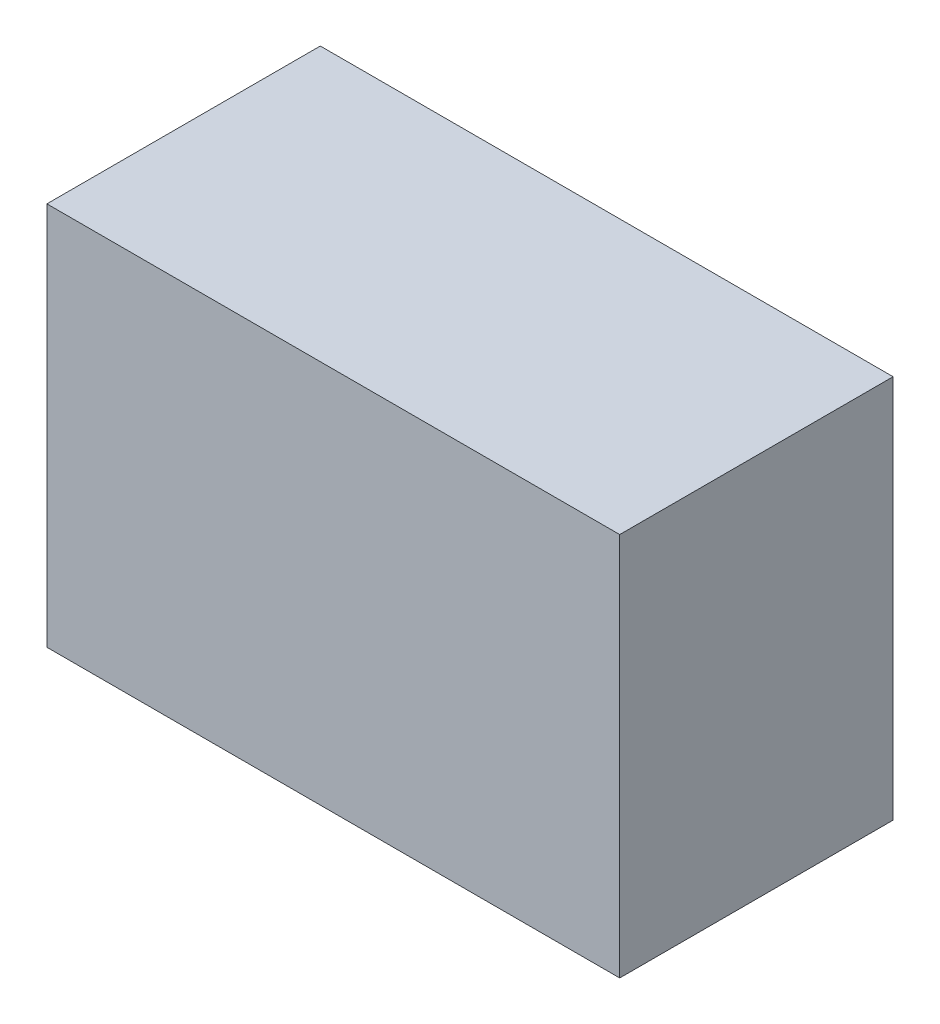
ISO-10303-21;
HEADER;
FILE_DESCRIPTION(('STEP AP214'),'2;1');
FILE_NAME('part.step','',(''),(''),'','','');
FILE_SCHEMA(('AUTOMOTIVE_DESIGN { 1 0 10303 214 1 1 1 1 }'));
ENDSEC;
DATA;
#1=APPLICATION_CONTEXT('core data for automotive mechanical design processes');
#2=APPLICATION_PROTOCOL_DEFINITION('international standard','automotive_design',2000,#1);
#3=PRODUCT_CONTEXT('',#1,'mechanical');
#4=PRODUCT('Part','Part','',(#3));
#5=PRODUCT_RELATED_PRODUCT_CATEGORY('part','',(#4));
#6=PRODUCT_DEFINITION_FORMATION('','',#4);
#7=PRODUCT_DEFINITION_CONTEXT('part definition',#1,'design');
#8=PRODUCT_DEFINITION('design','',#6,#7);
#9=PRODUCT_DEFINITION_SHAPE('','',#8);
#10=(LENGTH_UNIT() NAMED_UNIT(*) SI_UNIT(.MILLI.,.METRE.));
#11=(NAMED_UNIT(*) PLANE_ANGLE_UNIT() SI_UNIT($,.RADIAN.));
#12=(NAMED_UNIT(*) SI_UNIT($,.STERADIAN.) SOLID_ANGLE_UNIT());
#13=UNCERTAINTY_MEASURE_WITH_UNIT(LENGTH_MEASURE(1.E-05),#10,'distance_accuracy_value','');
#14=(GEOMETRIC_REPRESENTATION_CONTEXT(3) GLOBAL_UNCERTAINTY_ASSIGNED_CONTEXT((#13)) GLOBAL_UNIT_ASSIGNED_CONTEXT((#10,
#11,#12)) REPRESENTATION_CONTEXT('',''));
#15=CARTESIAN_POINT('',(0.,0.,0.));
#16=DIRECTION('',(0.,0.,1.));
#17=DIRECTION('',(1.,0.,0.));
#18=AXIS2_PLACEMENT_3D('',#15,#16,#17);
#19=CARTESIAN_POINT('',(-220.,295.,-95.));
#20=DIRECTION('',(1.,0.,0.));
#21=DIRECTION('',(0.,0.,-1.));
#22=AXIS2_PLACEMENT_3D('',#19,#20,#21);
#23=PLANE('',#22);
#24=DIRECTION('',(0.,0.,1.));
#25=VECTOR('',#24,1.);
#26=CARTESIAN_POINT('',(-220.,0.,-95.));
#27=LINE('',#26,#25);
#28=CARTESIAN_POINT('',(-220.,0.,-95.));
#29=VERTEX_POINT('',#28);
#30=CARTESIAN_POINT('',(-220.,0.,115.));
#31=VERTEX_POINT('',#30);
#32=EDGE_CURVE('E96',#29,#31,#27,.T.);
#33=ORIENTED_EDGE('',*,*,#32,.T.);
#34=DIRECTION('',(0.,-1.,0.));
#35=VECTOR('',#34,1.);
#36=CARTESIAN_POINT('',(-220.,295.,115.));
#37=LINE('',#36,#35);
#38=CARTESIAN_POINT('',(-220.,295.,115.));
#39=VERTEX_POINT('',#38);
#40=EDGE_CURVE('E11',#39,#31,#37,.T.);
#41=ORIENTED_EDGE('',*,*,#40,.F.);
#42=DIRECTION('',(0.,0.,1.));
#43=VECTOR('',#42,1.);
#44=CARTESIAN_POINT('',(-220.,295.,-95.));
#45=LINE('',#44,#43);
#46=CARTESIAN_POINT('',(-220.,295.,-95.));
#47=VERTEX_POINT('',#46);
#48=EDGE_CURVE('E84',#47,#39,#45,.T.);
#49=ORIENTED_EDGE('',*,*,#48,.F.);
#50=DIRECTION('',(0.,-1.,0.));
#51=VECTOR('',#50,1.);
#52=CARTESIAN_POINT('',(-220.,295.,-95.));
#53=LINE('',#52,#51);
#54=EDGE_CURVE('E92',#47,#29,#53,.T.);
#55=ORIENTED_EDGE('',*,*,#54,.T.);
#56=EDGE_LOOP('',(#33,#41,#49,#55));
#57=FACE_BOUND('',#56,.T.);
#58=ADVANCED_FACE('F33',(#57),#23,.F.);
#59=CARTESIAN_POINT('',(-220.,295.,115.));
#60=DIRECTION('',(0.,0.,-1.));
#61=DIRECTION('',(-1.,0.,0.));
#62=AXIS2_PLACEMENT_3D('',#59,#60,#61);
#63=PLANE('',#62);
#64=DIRECTION('',(1.,0.,0.));
#65=VECTOR('',#64,1.);
#66=CARTESIAN_POINT('',(-220.,0.,115.));
#67=LINE('',#66,#65);
#68=CARTESIAN_POINT('',(220.,0.,115.));
#69=VERTEX_POINT('',#68);
#70=EDGE_CURVE('E88',#31,#69,#67,.T.);
#71=ORIENTED_EDGE('',*,*,#70,.T.);
#72=DIRECTION('',(0.,-1.,0.));
#73=VECTOR('',#72,1.);
#74=CARTESIAN_POINT('',(220.,295.,115.));
#75=LINE('',#74,#73);
#76=CARTESIAN_POINT('',(220.,295.,115.));
#77=VERTEX_POINT('',#76);
#78=EDGE_CURVE('E41',#77,#69,#75,.T.);
#79=ORIENTED_EDGE('',*,*,#78,.F.);
#80=DIRECTION('',(1.,0.,0.));
#81=VECTOR('',#80,1.);
#82=CARTESIAN_POINT('',(-220.,295.,115.));
#83=LINE('',#82,#81);
#84=EDGE_CURVE('E79',#39,#77,#83,.T.);
#85=ORIENTED_EDGE('',*,*,#84,.F.);
#86=ORIENTED_EDGE('',*,*,#40,.T.);
#87=EDGE_LOOP('',(#71,#79,#85,#86));
#88=FACE_BOUND('',#87,.T.);
#89=ADVANCED_FACE('F87',(#88),#63,.F.);
#90=CARTESIAN_POINT('',(220.,295.,-95.));
#91=DIRECTION('',(-1.,0.,0.));
#92=DIRECTION('',(0.,0.,1.));
#93=AXIS2_PLACEMENT_3D('',#90,#91,#92);
#94=PLANE('',#93);
#95=DIRECTION('',(0.,0.,-1.));
#96=VECTOR('',#95,1.);
#97=CARTESIAN_POINT('',(220.,0.,-95.));
#98=LINE('',#97,#96);
#99=CARTESIAN_POINT('',(220.,0.,-95.));
#100=VERTEX_POINT('',#99);
#101=EDGE_CURVE('E66',#69,#100,#98,.T.);
#102=ORIENTED_EDGE('',*,*,#101,.T.);
#103=DIRECTION('',(0.,-1.,0.));
#104=VECTOR('',#103,1.);
#105=CARTESIAN_POINT('',(220.,295.,-95.));
#106=LINE('',#105,#104);
#107=CARTESIAN_POINT('',(220.,295.,-95.));
#108=VERTEX_POINT('',#107);
#109=EDGE_CURVE('E89',#108,#100,#106,.T.);
#110=ORIENTED_EDGE('',*,*,#109,.F.);
#111=DIRECTION('',(0.,0.,-1.));
#112=VECTOR('',#111,1.);
#113=CARTESIAN_POINT('',(220.,295.,-95.));
#114=LINE('',#113,#112);
#115=EDGE_CURVE('E82',#77,#108,#114,.T.);
#116=ORIENTED_EDGE('',*,*,#115,.F.);
#117=ORIENTED_EDGE('',*,*,#78,.T.);
#118=EDGE_LOOP('',(#102,#110,#116,#117));
#119=FACE_BOUND('',#118,.T.);
#120=ADVANCED_FACE('F90',(#119),#94,.F.);
#121=CARTESIAN_POINT('',(-220.,295.,-95.));
#122=DIRECTION('',(0.,0.,1.));
#123=DIRECTION('',(1.,0.,0.));
#124=AXIS2_PLACEMENT_3D('',#121,#122,#123);
#125=PLANE('',#124);
#126=DIRECTION('',(-1.,0.,0.));
#127=VECTOR('',#126,1.);
#128=CARTESIAN_POINT('',(-220.,0.,-95.));
#129=LINE('',#128,#127);
#130=EDGE_CURVE('E72',#100,#29,#129,.T.);
#131=ORIENTED_EDGE('',*,*,#130,.T.);
#132=ORIENTED_EDGE('',*,*,#54,.F.);
#133=DIRECTION('',(-1.,0.,0.));
#134=VECTOR('',#133,1.);
#135=CARTESIAN_POINT('',(-220.,295.,-95.));
#136=LINE('',#135,#134);
#137=EDGE_CURVE('E49',#108,#47,#136,.T.);
#138=ORIENTED_EDGE('',*,*,#137,.F.);
#139=ORIENTED_EDGE('',*,*,#109,.T.);
#140=EDGE_LOOP('',(#131,#132,#138,#139));
#141=FACE_BOUND('',#140,.T.);
#142=ADVANCED_FACE('F103',(#141),#125,.F.);
#143=CARTESIAN_POINT('',(0.,295.,0.));
#144=DIRECTION('',(0.,1.,0.));
#145=DIRECTION('',(0.,0.,1.));
#146=AXIS2_PLACEMENT_3D('',#143,#144,#145);
#147=PLANE('',#146);
#148=ORIENTED_EDGE('',*,*,#48,.T.);
#149=ORIENTED_EDGE('',*,*,#84,.T.);
#150=ORIENTED_EDGE('',*,*,#115,.T.);
#151=ORIENTED_EDGE('',*,*,#137,.T.);
#152=EDGE_LOOP('',(#148,#149,#150,#151));
#153=FACE_BOUND('',#152,.T.);
#154=ADVANCED_FACE('F80',(#153),#147,.T.);
#155=CARTESIAN_POINT('',(0.,0.,0.));
#156=DIRECTION('',(0.,1.,0.));
#157=DIRECTION('',(0.,0.,1.));
#158=AXIS2_PLACEMENT_3D('',#155,#156,#157);
#159=PLANE('',#158);
#160=ORIENTED_EDGE('',*,*,#32,.F.);
#161=ORIENTED_EDGE('',*,*,#130,.F.);
#162=ORIENTED_EDGE('',*,*,#101,.F.);
#163=ORIENTED_EDGE('',*,*,#70,.F.);
#164=EDGE_LOOP('',(#160,#161,#162,#163));
#165=FACE_BOUND('',#164,.T.);
#166=ADVANCED_FACE('F106',(#165),#159,.F.);
#167=CLOSED_SHELL('',(#58,#89,#120,#142,#154,#166));
#168=MANIFOLD_SOLID_BREP('B2',#167);
#169=ADVANCED_BREP_SHAPE_REPRESENTATION('',(#18,#168),#14);
#170=SHAPE_DEFINITION_REPRESENTATION(#9,#169);
ENDSEC;
END-ISO-10303-21;
